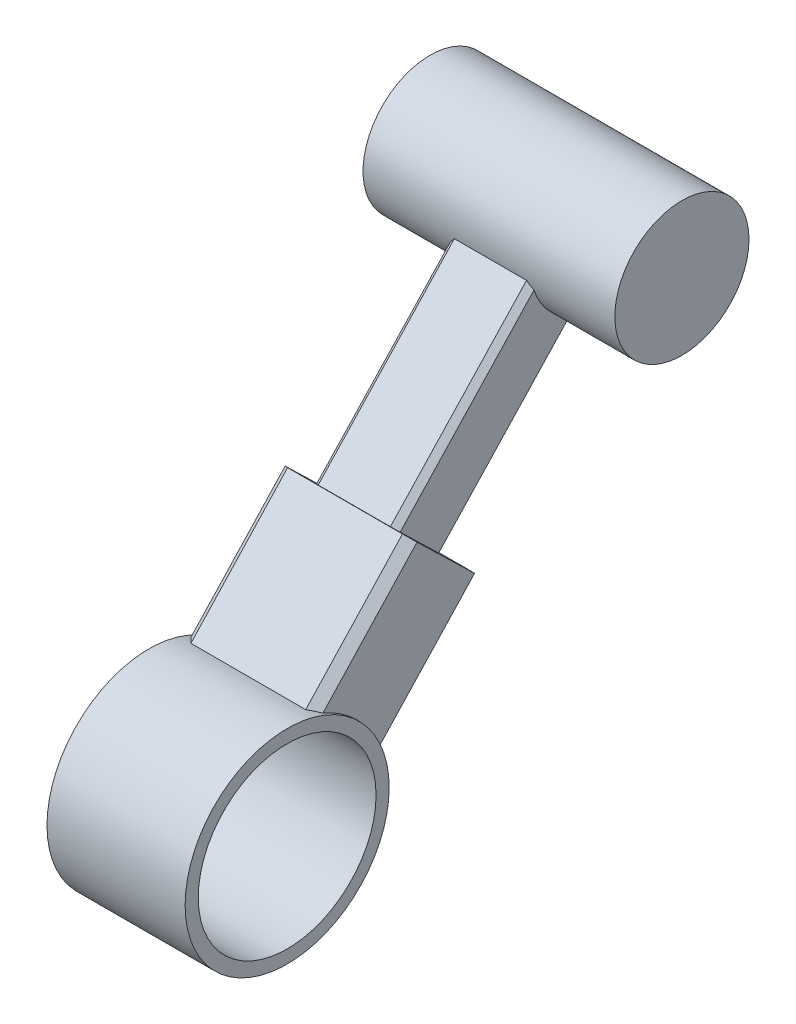
ISO-10303-21;
HEADER;
FILE_DESCRIPTION(('STEP AP214'),'2;1');
FILE_NAME('part.step','',(''),(''),'','','');
FILE_SCHEMA(('AUTOMOTIVE_DESIGN { 1 0 10303 214 1 1 1 1 }'));
ENDSEC;
DATA;
#1=APPLICATION_CONTEXT('core data for automotive mechanical design processes');
#2=APPLICATION_PROTOCOL_DEFINITION('international standard','automotive_design',2000,#1);
#3=PRODUCT_CONTEXT('',#1,'mechanical');
#4=PRODUCT('Part','Part','',(#3));
#5=PRODUCT_RELATED_PRODUCT_CATEGORY('part','',(#4));
#6=PRODUCT_DEFINITION_FORMATION('','',#4);
#7=PRODUCT_DEFINITION_CONTEXT('part definition',#1,'design');
#8=PRODUCT_DEFINITION('design','',#6,#7);
#9=PRODUCT_DEFINITION_SHAPE('','',#8);
#10=(LENGTH_UNIT() NAMED_UNIT(*) SI_UNIT(.MILLI.,.METRE.));
#11=(NAMED_UNIT(*) PLANE_ANGLE_UNIT() SI_UNIT($,.RADIAN.));
#12=(NAMED_UNIT(*) SI_UNIT($,.STERADIAN.) SOLID_ANGLE_UNIT());
#13=UNCERTAINTY_MEASURE_WITH_UNIT(LENGTH_MEASURE(1.E-05),#10,'distance_accuracy_value','');
#14=(GEOMETRIC_REPRESENTATION_CONTEXT(3) GLOBAL_UNCERTAINTY_ASSIGNED_CONTEXT((#13)) GLOBAL_UNIT_ASSIGNED_CONTEXT((#10,
#11,#12)) REPRESENTATION_CONTEXT('',''));
#15=CARTESIAN_POINT('',(0.,0.,0.));
#16=DIRECTION('',(0.,0.,1.));
#17=DIRECTION('',(1.,0.,0.));
#18=AXIS2_PLACEMENT_3D('',#15,#16,#17);
#19=CARTESIAN_POINT('',(-12.238736,481.689156,-114.7191));
#20=DIRECTION('',(0.,0.683904688442069,0.729571365341977));
#21=DIRECTION('',(0.,-0.729571365341977,0.683904688442069));
#22=AXIS2_PLACEMENT_3D('',#19,#20,#21);
#23=PLANE('',#22);
#24=DIRECTION('',(1.,0.,0.));
#25=VECTOR('',#24,1.);
#26=CARTESIAN_POINT('',(-36.886896,537.03398544481,-166.599683773447));
#27=LINE('',#26,#25);
#28=CARTESIAN_POINT('',(-10.573766,537.03398544481,-166.599683773447));
#29=VERTEX_POINT('',#28);
#30=CARTESIAN_POINT('',(10.5737660000001,537.03398544481,-166.599683773447));
#31=VERTEX_POINT('',#30);
#32=EDGE_CURVE('E167',#29,#31,#27,.T.);
#33=ORIENTED_EDGE('',*,*,#32,.F.);
#34=DIRECTION('',(0.,-0.729571365341977,0.683904688442069));
#35=VECTOR('',#34,1.);
#36=CARTESIAN_POINT('',(-10.573766,494.482198598491,-126.711376874032));
#37=LINE('',#36,#35);
#38=CARTESIAN_POINT('',(-10.573766,494.482198598491,-126.711376874032));
#39=VERTEX_POINT('',#38);
#40=EDGE_CURVE('E184',#29,#39,#37,.T.);
#41=ORIENTED_EDGE('',*,*,#40,.T.);
#42=DIRECTION('',(-1.,0.,0.));
#43=VECTOR('',#42,1.);
#44=CARTESIAN_POINT('',(-12.238736,494.482198598491,-126.711376874032));
#45=LINE('',#44,#43);
#46=CARTESIAN_POINT('',(10.5737660000001,494.482198598491,-126.711376874032));
#47=VERTEX_POINT('',#46);
#48=EDGE_CURVE('E265',#47,#39,#45,.T.);
#49=ORIENTED_EDGE('',*,*,#48,.F.);
#50=DIRECTION('',(0.,0.729571365341977,-0.683904688442069));
#51=VECTOR('',#50,1.);
#52=CARTESIAN_POINT('',(10.5737660000001,481.689156,-114.7191));
#53=LINE('',#52,#51);
#54=EDGE_CURVE('E182',#47,#31,#53,.T.);
#55=ORIENTED_EDGE('',*,*,#54,.T.);
#56=EDGE_LOOP('',(#33,#41,#49,#55));
#57=FACE_BOUND('',#56,.T.);
#58=ADVANCED_FACE('F33',(#57),#23,.T.);
#59=CARTESIAN_POINT('',(-12.238736,534.280364,-190.081662));
#60=DIRECTION('',(0.,-0.683673681243976,-0.72978784422208));
#61=DIRECTION('',(0.,0.72978784422208,-0.683673681243976));
#62=AXIS2_PLACEMENT_3D('',#59,#60,#61);
#63=PLANE('',#62);
#64=DIRECTION('',(1.,0.,0.));
#65=VECTOR('',#64,1.);
#66=CARTESIAN_POINT('',(-12.238736,481.231547229503,-140.384917755399));
#67=LINE('',#66,#65);
#68=CARTESIAN_POINT('',(-10.5737660000001,481.231547229503,-140.384917755399));
#69=VERTEX_POINT('',#68);
#70=CARTESIAN_POINT('',(10.5737660000001,481.231547229503,-140.384917755399));
#71=VERTEX_POINT('',#70);
#72=EDGE_CURVE('E262',#69,#71,#67,.T.);
#73=ORIENTED_EDGE('',*,*,#72,.F.);
#74=DIRECTION('',(0.,0.72978784422208,-0.683673681243976));
#75=VECTOR('',#74,1.);
#76=CARTESIAN_POINT('',(-10.5737660000001,522.674759628456,-179.209397784346));
#77=LINE('',#76,#75);
#78=CARTESIAN_POINT('',(-10.5737660000001,522.674759628456,-179.209397784346));
#79=VERTEX_POINT('',#78);
#80=EDGE_CURVE('E166',#69,#79,#77,.T.);
#81=ORIENTED_EDGE('',*,*,#80,.T.);
#82=DIRECTION('',(1.,0.,0.));
#83=VECTOR('',#82,1.);
#84=CARTESIAN_POINT('',(-36.886896,522.674759628456,-179.209397784346));
#85=LINE('',#84,#83);
#86=CARTESIAN_POINT('',(10.5737660000001,522.674759628456,-179.209397784346));
#87=VERTEX_POINT('',#86);
#88=EDGE_CURVE('E149',#87,#79,#85,.F.);
#89=ORIENTED_EDGE('',*,*,#88,.F.);
#90=DIRECTION('',(0.,-0.72978784422208,0.683673681243976));
#91=VECTOR('',#90,1.);
#92=CARTESIAN_POINT('',(10.5737660000001,534.280364,-190.081662));
#93=LINE('',#92,#91);
#94=EDGE_CURVE('E163',#87,#71,#93,.T.);
#95=ORIENTED_EDGE('',*,*,#94,.T.);
#96=EDGE_LOOP('',(#73,#81,#89,#95));
#97=FACE_BOUND('',#96,.T.);
#98=ADVANCED_FACE('F162',(#97),#63,.T.);
#99=CARTESIAN_POINT('',(-12.238736,0.,0.));
#100=DIRECTION('',(1.,0.,0.));
#101=DIRECTION('',(0.,0.,-1.));
#102=AXIS2_PLACEMENT_3D('',#99,#100,#101);
#103=PLANE('',#102);
#104=CARTESIAN_POINT('',(-12.238736,541.18891,-185.811668));
#105=DIRECTION('',(1.,0.,0.));
#106=DIRECTION('',(0.,0.,-1.));
#107=AXIS2_PLACEMENT_3D('',#104,#105,#106);
#108=CIRCLE('',#107,19.6561373616654);
#109=CARTESIAN_POINT('',(-12.238736,535.142411102994,-167.108631159178));
#110=VERTEX_POINT('',#109);
#111=CARTESIAN_POINT('',(-12.238736,523.348910888347,-177.559506605742));
#112=VERTEX_POINT('',#111);
#113=EDGE_CURVE('E307',#110,#112,#108,.T.);
#114=ORIENTED_EDGE('',*,*,#113,.T.);
#115=DIRECTION('',(0.,-0.72978784422208,0.683673681243976));
#116=VECTOR('',#115,1.);
#117=CARTESIAN_POINT('',(-12.238736,482.369843398563,-139.169842888405));
#118=LINE('',#117,#116);
#119=CARTESIAN_POINT('',(-12.238736,482.390389885968,-139.18909107511));
#120=VERTEX_POINT('',#119);
#121=EDGE_CURVE('E180',#112,#120,#118,.T.);
#122=ORIENTED_EDGE('',*,*,#121,.T.);
#123=DIRECTION('',(0.,0.695914649796083,0.718124501879163));
#124=VECTOR('',#123,1.);
#125=CARTESIAN_POINT('',(-12.238736,318.330290965437,-308.485105823577));
#126=LINE('',#125,#124);
#127=CARTESIAN_POINT('',(-12.238736,493.323362087641,-127.907197212572));
#128=VERTEX_POINT('',#127);
#129=EDGE_CURVE('E274',#120,#128,#126,.T.);
#130=ORIENTED_EDGE('',*,*,#129,.T.);
#131=DIRECTION('',(0.,0.729571365341977,-0.683904688442069));
#132=VECTOR('',#131,1.);
#133=CARTESIAN_POINT('',(-12.238736,535.895304655695,-167.8143982096));
#134=LINE('',#133,#132);
#135=EDGE_CURVE('E173',#128,#110,#134,.T.);
#136=ORIENTED_EDGE('',*,*,#135,.T.);
#137=EDGE_LOOP('',(#114,#122,#130,#136));
#138=FACE_BOUND('',#137,.T.);
#139=ADVANCED_FACE('F351',(#138),#103,.F.);
#140=CARTESIAN_POINT('',(12.238736,0.,0.));
#141=DIRECTION('',(1.,0.,0.));
#142=DIRECTION('',(0.,0.,-1.));
#143=AXIS2_PLACEMENT_3D('',#140,#141,#142);
#144=PLANE('',#143);
#145=DIRECTION('',(0.,0.695914649796083,0.718124501879163));
#146=VECTOR('',#145,1.);
#147=CARTESIAN_POINT('',(12.238736,318.330290965437,-308.485105823577));
#148=LINE('',#147,#146);
#149=CARTESIAN_POINT('',(12.238736,482.390389885968,-139.18909107511));
#150=VERTEX_POINT('',#149);
#151=CARTESIAN_POINT('',(12.238736,493.323362087641,-127.907197212572));
#152=VERTEX_POINT('',#151);
#153=EDGE_CURVE('E277',#150,#152,#148,.T.);
#154=ORIENTED_EDGE('',*,*,#153,.F.);
#155=DIRECTION('',(0.,0.72978784422208,-0.683673681243976));
#156=VECTOR('',#155,1.);
#157=CARTESIAN_POINT('',(12.238736,156.027396968547,166.551530060471));
#158=LINE('',#157,#156);
#159=CARTESIAN_POINT('',(12.238736,523.348910888347,-177.559506605742));
#160=VERTEX_POINT('',#159);
#161=EDGE_CURVE('E190',#150,#160,#158,.T.);
#162=ORIENTED_EDGE('',*,*,#161,.T.);
#163=CARTESIAN_POINT('',(12.238736,541.18891,-185.811668));
#164=DIRECTION('',(1.,0.,0.));
#165=DIRECTION('',(0.,0.,-1.));
#166=AXIS2_PLACEMENT_3D('',#163,#164,#165);
#167=CIRCLE('',#166,19.6561373616654);
#168=CARTESIAN_POINT('',(12.238736,535.142411102994,-167.108631159178));
#169=VERTEX_POINT('',#168);
#170=EDGE_CURVE('E151',#169,#160,#167,.T.);
#171=ORIENTED_EDGE('',*,*,#170,.F.);
#172=DIRECTION('',(0.,-0.729571365341977,0.683904688442069));
#173=VECTOR('',#172,1.);
#174=CARTESIAN_POINT('',(12.238736,166.919749940669,178.065557854515));
#175=LINE('',#174,#173);
#176=EDGE_CURVE('E187',#169,#152,#175,.T.);
#177=ORIENTED_EDGE('',*,*,#176,.T.);
#178=EDGE_LOOP('',(#154,#162,#171,#177));
#179=FACE_BOUND('',#178,.T.);
#180=ADVANCED_FACE('F497',(#179),#144,.T.);
#181=CARTESIAN_POINT('',(-19.311112,497.124482,-123.984766));
#182=DIRECTION('',(0.,0.718124501879163,-0.695914649796082));
#183=DIRECTION('',(0.,0.695914649796083,0.718124501879163));
#184=AXIS2_PLACEMENT_3D('',#181,#182,#183);
#185=PLANE('',#184);
#186=DIRECTION('',(1.,0.,0.));
#187=VECTOR('',#186,1.);
#188=CARTESIAN_POINT('',(-19.311112,477.32315,-144.41805));
#189=LINE('',#188,#187);
#190=CARTESIAN_POINT('',(-16.824198,477.32315,-144.41805));
#191=VERTEX_POINT('',#190);
#192=CARTESIAN_POINT('',(16.824198,477.32315,-144.41805));
#193=VERTEX_POINT('',#192);
#194=EDGE_CURVE('E263',#191,#193,#189,.T.);
#195=ORIENTED_EDGE('',*,*,#194,.F.);
#196=DIRECTION('',(0.707041596022458,-0.492131327127046,-0.507837511763545));
#197=VECTOR('',#196,1.);
#198=CARTESIAN_POINT('',(-32.2942649700346,488.090981244352,-133.306567505796));
#199=LINE('',#198,#197);
#200=CARTESIAN_POINT('',(-19.311112,479.054148988116,-142.631806835758));
#201=VERTEX_POINT('',#200);
#202=EDGE_CURVE('E215',#191,#201,#199,.F.);
#203=ORIENTED_EDGE('',*,*,#202,.T.);
#204=DIRECTION('',(0.,0.695914649796082,0.718124501879163));
#205=VECTOR('',#204,1.);
#206=CARTESIAN_POINT('',(-19.311112,497.124482,-123.984766));
#207=LINE('',#206,#205);
#208=CARTESIAN_POINT('',(-19.311112,495.393467348327,-125.771025327695));
#209=VERTEX_POINT('',#208);
#210=EDGE_CURVE('E258',#201,#209,#207,.T.);
#211=ORIENTED_EDGE('',*,*,#210,.T.);
#212=DIRECTION('',(-0.707038396481972,-0.492133553313604,-0.507839808998003));
#213=VECTOR('',#212,1.);
#214=CARTESIAN_POINT('',(-18.0674145007429,496.259142073494,-124.877722922031));
#215=LINE('',#214,#213);
#216=CARTESIAN_POINT('',(-16.824198,497.124482,-123.984766));
#217=VERTEX_POINT('',#216);
#218=EDGE_CURVE('E211',#209,#217,#215,.F.);
#219=ORIENTED_EDGE('',*,*,#218,.T.);
#220=DIRECTION('',(1.,0.,0.));
#221=VECTOR('',#220,1.);
#222=CARTESIAN_POINT('',(-19.311112,497.124482,-123.984766));
#223=LINE('',#222,#221);
#224=CARTESIAN_POINT('',(16.824198,497.124482,-123.984766));
#225=VERTEX_POINT('',#224);
#226=EDGE_CURVE('E256',#217,#225,#223,.T.);
#227=ORIENTED_EDGE('',*,*,#226,.T.);
#228=DIRECTION('',(0.707038396481976,-0.492133553313601,-0.507839808998));
#229=VECTOR('',#228,1.);
#230=CARTESIAN_POINT('',(-1.23996250231758,509.698027566785,-111.009940495682));
#231=LINE('',#230,#229);
#232=CARTESIAN_POINT('',(19.311112,495.393467348327,-125.771025327695));
#233=VERTEX_POINT('',#232);
#234=EDGE_CURVE('E209',#225,#233,#231,.T.);
#235=ORIENTED_EDGE('',*,*,#234,.T.);
#236=DIRECTION('',(0.,0.695914649796082,0.718124501879163));
#237=VECTOR('',#236,1.);
#238=CARTESIAN_POINT('',(19.311112,497.124482,-123.984766));
#239=LINE('',#238,#237);
#240=CARTESIAN_POINT('',(19.311112,479.054148988116,-142.631806835758));
#241=VERTEX_POINT('',#240);
#242=EDGE_CURVE('E246',#241,#233,#239,.T.);
#243=ORIENTED_EDGE('',*,*,#242,.F.);
#244=DIRECTION('',(-0.707041596022462,-0.492131327127043,-0.507837511763542));
#245=VECTOR('',#244,1.);
#246=CARTESIAN_POINT('',(12.9867132243449,474.652095728091,-147.174349955848));
#247=LINE('',#246,#245);
#248=EDGE_CURVE('E213',#241,#193,#247,.T.);
#249=ORIENTED_EDGE('',*,*,#248,.T.);
#250=EDGE_LOOP('',(#195,#203,#211,#219,#227,#235,#243,#249));
#251=FACE_BOUND('',#250,.T.);
#252=ORIENTED_EDGE('',*,*,#129,.F.);
#253=DIRECTION('',(0.707056239754541,-0.492121138007002,-0.507826997461599));
#254=VECTOR('',#253,1.);
#255=CARTESIAN_POINT('',(-11.1882655133554,481.659247577529,-139.943567512996));
#256=LINE('',#255,#254);
#257=EDGE_CURVE('E194',#120,#69,#256,.T.);
#258=ORIENTED_EDGE('',*,*,#257,.T.);
#259=ORIENTED_EDGE('',*,*,#72,.T.);
#260=DIRECTION('',(-0.707056239754517,-0.492121138007018,-0.507826997461616));
#261=VECTOR('',#260,1.);
#262=CARTESIAN_POINT('',(8.45825770596831,479.75912355146,-141.904333276626));
#263=LINE('',#262,#261);
#264=EDGE_CURVE('E156',#71,#150,#263,.F.);
#265=ORIENTED_EDGE('',*,*,#264,.T.);
#266=ORIENTED_EDGE('',*,*,#153,.T.);
#267=DIRECTION('',(0.707058114867813,-0.492119833271268,-0.507825651085719));
#268=VECTOR('',#267,1.);
#269=CARTESIAN_POINT('',(15.9499975239881,490.740285302287,-130.572711913751));
#270=LINE('',#269,#268);
#271=EDGE_CURVE('E200',#152,#47,#270,.F.);
#272=ORIENTED_EDGE('',*,*,#271,.T.);
#273=ORIENTED_EDGE('',*,*,#48,.T.);
#274=DIRECTION('',(-0.707058114867824,-0.49211983327126,-0.507825651085711));
#275=VECTOR('',#274,1.);
#276=CARTESIAN_POINT('',(-10.7192249502188,494.380957649799,-126.8158488892));
#277=LINE('',#276,#275);
#278=EDGE_CURVE('E196',#39,#128,#277,.T.);
#279=ORIENTED_EDGE('',*,*,#278,.T.);
#280=EDGE_LOOP('',(#252,#258,#259,#265,#266,#272,#273,#279));
#281=FACE_BOUND('',#280,.T.);
#282=ADVANCED_FACE('F254',(#251,#281),#185,.T.);
#283=CARTESIAN_POINT('',(-19.311112,447.540126,-77.789786));
#284=DIRECTION('',(0.,0.681657478586852,0.731671430279066));
#285=DIRECTION('',(0.,-0.731671430279066,0.681657478586852));
#286=AXIS2_PLACEMENT_3D('',#283,#284,#285);
#287=PLANE('',#286);
#288=ORIENTED_EDGE('',*,*,#226,.F.);
#289=DIRECTION('',(0.,-0.731671430279066,0.681657478586852));
#290=VECTOR('',#289,1.);
#291=CARTESIAN_POINT('',(-16.824198,447.540126,-77.789786));
#292=LINE('',#291,#290);
#293=CARTESIAN_POINT('',(-16.824198,466.715413431716,-95.6543322170037));
#294=VERTEX_POINT('',#293);
#295=EDGE_CURVE('E229',#217,#294,#292,.T.);
#296=ORIENTED_EDGE('',*,*,#295,.T.);
#297=DIRECTION('',(1.,0.,0.));
#298=VECTOR('',#297,1.);
#299=CARTESIAN_POINT('',(-20.236688,466.715413431716,-95.6543322170037));
#300=LINE('',#299,#298);
#301=CARTESIAN_POINT('',(16.824198,466.715413431716,-95.6543322170037));
#302=VERTEX_POINT('',#301);
#303=EDGE_CURVE('E240',#302,#294,#300,.F.);
#304=ORIENTED_EDGE('',*,*,#303,.F.);
#305=DIRECTION('',(0.,0.731671430279066,-0.681657478586852));
#306=VECTOR('',#305,1.);
#307=CARTESIAN_POINT('',(16.824198,497.124482,-123.984766));
#308=LINE('',#307,#306);
#309=EDGE_CURVE('E227',#302,#225,#308,.T.);
#310=ORIENTED_EDGE('',*,*,#309,.T.);
#311=EDGE_LOOP('',(#288,#296,#304,#310));
#312=FACE_BOUND('',#311,.T.);
#313=ADVANCED_FACE('F260',(#312),#287,.T.);
#314=CARTESIAN_POINT('',(-19.311112,477.32315,-144.41805));
#315=DIRECTION('',(0.,-0.681998033493572,-0.731354006149484));
#316=DIRECTION('',(0.,0.731354006149484,-0.681998033493572));
#317=AXIS2_PLACEMENT_3D('',#314,#315,#316);
#318=PLANE('',#317);
#319=DIRECTION('',(1.,0.,0.));
#320=VECTOR('',#319,1.);
#321=CARTESIAN_POINT('',(-20.236688,446.360114647019,-115.544578269254));
#322=LINE('',#321,#320);
#323=CARTESIAN_POINT('',(-16.824198,446.360114647019,-115.544578269254));
#324=VERTEX_POINT('',#323);
#325=CARTESIAN_POINT('',(16.824198,446.360114647019,-115.544578269254));
#326=VERTEX_POINT('',#325);
#327=EDGE_CURVE('E295',#324,#326,#322,.T.);
#328=ORIENTED_EDGE('',*,*,#327,.F.);
#329=DIRECTION('',(0.,0.731354006149484,-0.681998033493572));
#330=VECTOR('',#329,1.);
#331=CARTESIAN_POINT('',(-16.824198,477.32315,-144.41805));
#332=LINE('',#331,#330);
#333=EDGE_CURVE('E206',#324,#191,#332,.T.);
#334=ORIENTED_EDGE('',*,*,#333,.T.);
#335=ORIENTED_EDGE('',*,*,#194,.T.);
#336=DIRECTION('',(0.,-0.731354006149484,0.681998033493572));
#337=VECTOR('',#336,1.);
#338=CARTESIAN_POINT('',(16.824198,446.360114647019,-115.544578269254));
#339=LINE('',#338,#337);
#340=EDGE_CURVE('E204',#193,#326,#339,.T.);
#341=ORIENTED_EDGE('',*,*,#340,.T.);
#342=EDGE_LOOP('',(#328,#334,#335,#341));
#343=FACE_BOUND('',#342,.T.);
#344=ADVANCED_FACE('F292',(#343),#318,.T.);
#345=CARTESIAN_POINT('',(-19.311112,0.,0.));
#346=DIRECTION('',(-1.,0.,0.));
#347=DIRECTION('',(0.,0.,1.));
#348=AXIS2_PLACEMENT_3D('',#345,#346,#347);
#349=PLANE('',#348);
#350=ORIENTED_EDGE('',*,*,#210,.F.);
#351=DIRECTION('',(0.,-0.731354006149484,0.681998033493572));
#352=VECTOR('',#351,1.);
#353=CARTESIAN_POINT('',(-19.311112,151.676120003046,162.652870761515));
#354=LINE('',#353,#352);
#355=CARTESIAN_POINT('',(-19.311112,449.038801627589,-114.642067663779));
#356=VERTEX_POINT('',#355);
#357=EDGE_CURVE('E219',#201,#356,#354,.T.);
#358=ORIENTED_EDGE('',*,*,#357,.T.);
#359=CARTESIAN_POINT('',(-19.311112,438.166256,-86.798404));
#360=DIRECTION('',(-1.,0.,0.));
#361=DIRECTION('',(0.,0.,1.));
#362=AXIS2_PLACEMENT_3D('',#359,#360,#361);
#363=CIRCLE('',#362,29.8911668331234);
#364=CARTESIAN_POINT('',(-19.311112,465.798060138105,-98.1986344678023));
#365=VERTEX_POINT('',#364);
#366=EDGE_CURVE('E238',#365,#356,#363,.T.);
#367=ORIENTED_EDGE('',*,*,#366,.F.);
#368=DIRECTION('',(0.,0.731671430279066,-0.681657478586852));
#369=VECTOR('',#368,1.);
#370=CARTESIAN_POINT('',(-19.311112,167.459790657562,179.746497901937));
#371=LINE('',#370,#369);
#372=EDGE_CURVE('E217',#365,#209,#371,.T.);
#373=ORIENTED_EDGE('',*,*,#372,.T.);
#374=EDGE_LOOP('',(#350,#358,#367,#373));
#375=FACE_BOUND('',#374,.T.);
#376=ADVANCED_FACE('F243',(#375),#349,.T.);
#377=CARTESIAN_POINT('',(19.311112,0.,0.));
#378=DIRECTION('',(-1.,0.,0.));
#379=DIRECTION('',(0.,0.,1.));
#380=AXIS2_PLACEMENT_3D('',#377,#378,#379);
#381=PLANE('',#380);
#382=CARTESIAN_POINT('',(19.311112,438.166256,-86.798404));
#383=DIRECTION('',(-1.,0.,0.));
#384=DIRECTION('',(0.,0.,1.));
#385=AXIS2_PLACEMENT_3D('',#382,#383,#384);
#386=CIRCLE('',#385,29.8911668331234);
#387=CARTESIAN_POINT('',(19.311112,465.798060138105,-98.1986344678023));
#388=VERTEX_POINT('',#387);
#389=CARTESIAN_POINT('',(19.311112,449.038801627588,-114.642067663779));
#390=VERTEX_POINT('',#389);
#391=EDGE_CURVE('E175',#388,#390,#386,.T.);
#392=ORIENTED_EDGE('',*,*,#391,.T.);
#393=DIRECTION('',(0.,0.731354006149484,-0.681998033493572));
#394=VECTOR('',#393,1.);
#395=CARTESIAN_POINT('',(19.311112,479.019220457468,-142.599235483151));
#396=LINE('',#395,#394);
#397=EDGE_CURVE('E224',#390,#241,#396,.T.);
#398=ORIENTED_EDGE('',*,*,#397,.T.);
#399=ORIENTED_EDGE('',*,*,#242,.T.);
#400=DIRECTION('',(0.,-0.731671430279066,0.681657478586852));
#401=VECTOR('',#400,1.);
#402=CARTESIAN_POINT('',(19.311112,465.020189905013,-97.4739361403647));
#403=LINE('',#402,#401);
#404=EDGE_CURVE('E221',#233,#388,#403,.T.);
#405=ORIENTED_EDGE('',*,*,#404,.T.);
#406=EDGE_LOOP('',(#392,#398,#399,#405));
#407=FACE_BOUND('',#406,.T.);
#408=ADVANCED_FACE('F282',(#407),#381,.F.);
#409=CARTESIAN_POINT('',(-20.236688,438.166256,-86.798404));
#410=DIRECTION('',(1.,0.,0.));
#411=DIRECTION('',(0.,0.,-1.));
#412=AXIS2_PLACEMENT_3D('',#409,#410,#411);
#413=CYLINDRICAL_SURFACE('',#412,29.8911668331234);
#414=ORIENTED_EDGE('',*,*,#391,.F.);
#415=CARTESIAN_POINT('',(29.805315005699,438.166256,-86.798404));
#416=DIRECTION('',(0.707106781186536,0.482004625555295,0.517369829950797));
#417=DIRECTION('',(0.707106781186559,-0.482004625555279,-0.517369829950779));
#418=AXIS2_PLACEMENT_3D('',#415,#416,#417);
#419=ELLIPSE('',#418,42.2724935305607,29.8911668331234);
#420=EDGE_CURVE('E11',#388,#302,#419,.T.);
#421=ORIENTED_EDGE('',*,*,#420,.T.);
#422=ORIENTED_EDGE('',*,*,#303,.T.);
#423=CARTESIAN_POINT('',(-29.805315005699,438.166256,-86.798404));
#424=DIRECTION('',(0.70710678118654,-0.482004625555293,-0.517369829950794));
#425=DIRECTION('',(0.707106781186555,0.482004625555282,0.517369829950782));
#426=AXIS2_PLACEMENT_3D('',#423,#424,#425);
#427=ELLIPSE('',#426,42.2724935305604,29.8911668331234);
#428=EDGE_CURVE('E41',#294,#365,#427,.F.);
#429=ORIENTED_EDGE('',*,*,#428,.T.);
#430=ORIENTED_EDGE('',*,*,#366,.T.);
#431=CARTESIAN_POINT('',(-32.2596322292983,438.166256,-86.798404));
#432=DIRECTION('',(0.707106781186559,0.482245434239187,0.51714537719624));
#433=DIRECTION('',(0.707106781186536,-0.482245434239203,-0.517145377196257));
#434=AXIS2_PLACEMENT_3D('',#431,#432,#433);
#435=ELLIPSE('',#434,42.2724935305592,29.8911668331234);
#436=EDGE_CURVE('E231',#356,#324,#435,.F.);
#437=ORIENTED_EDGE('',*,*,#436,.T.);
#438=ORIENTED_EDGE('',*,*,#327,.T.);
#439=CARTESIAN_POINT('',(32.2596322292985,438.166256,-86.798404));
#440=DIRECTION('',(0.707106781186555,-0.48224543423919,-0.517145377196243));
#441=DIRECTION('',(0.70710678118654,0.482245434239201,0.517145377196254));
#442=AXIS2_PLACEMENT_3D('',#439,#440,#441);
#443=ELLIPSE('',#442,42.2724935305595,29.8911668331234);
#444=EDGE_CURVE('E233',#326,#390,#443,.T.);
#445=ORIENTED_EDGE('',*,*,#444,.T.);
#446=EDGE_LOOP('',(#414,#421,#422,#429,#430,#437,#438,#445));
#447=FACE_BOUND('',#446,.T.);
#448=CARTESIAN_POINT('',(-20.236688,438.166256,-86.798404));
#449=DIRECTION('',(1.,0.,0.));
#450=DIRECTION('',(0.,0.,-1.));
#451=AXIS2_PLACEMENT_3D('',#448,#449,#450);
#452=CIRCLE('',#451,29.8911668331234);
#453=CARTESIAN_POINT('',(-20.236688,438.166256,-116.689570833123));
#454=VERTEX_POINT('',#453);
#455=EDGE_CURVE('E301',#454,#454,#452,.T.);
#456=ORIENTED_EDGE('',*,*,#455,.T.);
#457=EDGE_LOOP('',(#456));
#458=FACE_BOUND('',#457,.T.);
#459=CARTESIAN_POINT('',(20.236688,438.166256,-86.798404));
#460=DIRECTION('',(1.,0.,0.));
#461=DIRECTION('',(0.,0.,-1.));
#462=AXIS2_PLACEMENT_3D('',#459,#460,#461);
#463=CIRCLE('',#462,29.8911668331234);
#464=CARTESIAN_POINT('',(20.236688,438.166256,-116.689570833123));
#465=VERTEX_POINT('',#464);
#466=EDGE_CURVE('E304',#465,#465,#463,.T.);
#467=ORIENTED_EDGE('',*,*,#466,.F.);
#468=EDGE_LOOP('',(#467));
#469=FACE_BOUND('',#468,.T.);
#470=ADVANCED_FACE('F236',(#447,#458,#469),#413,.T.);
#471=CARTESIAN_POINT('',(-20.236688,438.166256,-86.798404));
#472=DIRECTION('',(1.,0.,0.));
#473=DIRECTION('',(0.,0.,-1.));
#474=AXIS2_PLACEMENT_3D('',#471,#472,#473);
#475=PLANE('',#474);
#476=CARTESIAN_POINT('',(-20.236688,438.166256,-86.798404));
#477=DIRECTION('',(1.,0.,0.));
#478=DIRECTION('',(0.,0.,-1.));
#479=AXIS2_PLACEMENT_3D('',#476,#477,#478);
#480=CIRCLE('',#479,26.0502400000001);
#481=CARTESIAN_POINT('',(-20.236688,438.166256,-112.848644));
#482=VERTEX_POINT('',#481);
#483=EDGE_CURVE('E317',#482,#482,#480,.T.);
#484=ORIENTED_EDGE('',*,*,#483,.T.);
#485=EDGE_LOOP('',(#484));
#486=FACE_BOUND('',#485,.T.);
#487=ORIENTED_EDGE('',*,*,#455,.F.);
#488=EDGE_LOOP('',(#487));
#489=FACE_BOUND('',#488,.T.);
#490=ADVANCED_FACE('F330',(#486,#489),#475,.F.);
#491=CARTESIAN_POINT('',(20.236688,438.166256,-86.798404));
#492=DIRECTION('',(1.,0.,0.));
#493=DIRECTION('',(0.,0.,-1.));
#494=AXIS2_PLACEMENT_3D('',#491,#492,#493);
#495=PLANE('',#494);
#496=CARTESIAN_POINT('',(20.236688,438.166256,-86.798404));
#497=DIRECTION('',(1.,0.,0.));
#498=DIRECTION('',(0.,0.,-1.));
#499=AXIS2_PLACEMENT_3D('',#496,#497,#498);
#500=CIRCLE('',#499,26.0502400000001);
#501=CARTESIAN_POINT('',(20.236688,438.166256,-112.848644));
#502=VERTEX_POINT('',#501);
#503=EDGE_CURVE('E320',#502,#502,#500,.T.);
#504=ORIENTED_EDGE('',*,*,#503,.F.);
#505=EDGE_LOOP('',(#504));
#506=FACE_BOUND('',#505,.T.);
#507=ORIENTED_EDGE('',*,*,#466,.T.);
#508=EDGE_LOOP('',(#507));
#509=FACE_BOUND('',#508,.T.);
#510=ADVANCED_FACE('F327',(#506,#509),#495,.T.);
#511=CARTESIAN_POINT('',(-36.886896,541.18891,-185.811668));
#512=DIRECTION('',(1.,0.,0.));
#513=DIRECTION('',(0.,0.,-1.));
#514=AXIS2_PLACEMENT_3D('',#511,#512,#513);
#515=CYLINDRICAL_SURFACE('',#514,19.6561373616654);
#516=CARTESIAN_POINT('',(36.886896,541.18891,-185.811668));
#517=DIRECTION('',(1.,0.,0.));
#518=DIRECTION('',(0.,0.,-1.));
#519=AXIS2_PLACEMENT_3D('',#516,#517,#518);
#520=CIRCLE('',#519,19.6561373616654);
#521=CARTESIAN_POINT('',(36.886896,541.18891,-205.467805361665));
#522=VERTEX_POINT('',#521);
#523=EDGE_CURVE('E314',#522,#522,#520,.T.);
#524=ORIENTED_EDGE('',*,*,#523,.F.);
#525=EDGE_LOOP('',(#524));
#526=FACE_BOUND('',#525,.T.);
#527=CARTESIAN_POINT('',(-36.886896,541.18891,-185.811668));
#528=DIRECTION('',(1.,0.,0.));
#529=DIRECTION('',(0.,0.,-1.));
#530=AXIS2_PLACEMENT_3D('',#527,#528,#529);
#531=CIRCLE('',#530,19.6561373616654);
#532=CARTESIAN_POINT('',(-36.886896,541.18891,-205.467805361665));
#533=VERTEX_POINT('',#532);
#534=EDGE_CURVE('E168',#533,#533,#531,.T.);
#535=ORIENTED_EDGE('',*,*,#534,.T.);
#536=EDGE_LOOP('',(#535));
#537=FACE_BOUND('',#536,.T.);
#538=ORIENTED_EDGE('',*,*,#113,.F.);
#539=CARTESIAN_POINT('',(-21.7487071796776,541.18891,-185.811668));
#540=DIRECTION('',(-0.707106781186547,0.48359364288266,0.51588485979284));
#541=DIRECTION('',(0.707106781186548,0.48359364288266,0.51588485979284));
#542=AXIS2_PLACEMENT_3D('',#539,#540,#541);
#543=ELLIPSE('',#542,27.7979760407357,19.6561373616654);
#544=EDGE_CURVE('E157',#110,#29,#543,.T.);
#545=ORIENTED_EDGE('',*,*,#544,.T.);
#546=ORIENTED_EDGE('',*,*,#32,.T.);
#547=CARTESIAN_POINT('',(21.7487071796774,541.18891,-185.811668));
#548=DIRECTION('',(-0.707106781186559,-0.483593642882652,-0.515884859792832));
#549=DIRECTION('',(0.707106781186536,-0.483593642882668,-0.515884859792849));
#550=AXIS2_PLACEMENT_3D('',#547,#548,#549);
#551=ELLIPSE('',#550,27.7979760407352,19.6561373616654);
#552=EDGE_CURVE('E202',#31,#169,#551,.F.);
#553=ORIENTED_EDGE('',*,*,#552,.T.);
#554=ORIENTED_EDGE('',*,*,#170,.T.);
#555=CARTESIAN_POINT('',(18.4131467919646,541.18891,-185.811668));
#556=DIRECTION('',(-0.707106781186547,0.483430296126385,0.516037933476944));
#557=DIRECTION('',(0.707106781186548,0.483430296126386,0.516037933476944));
#558=AXIS2_PLACEMENT_3D('',#555,#556,#557);
#559=ELLIPSE('',#558,27.7979760407357,19.6561373616654);
#560=EDGE_CURVE('E145',#160,#87,#559,.F.);
#561=ORIENTED_EDGE('',*,*,#560,.T.);
#562=ORIENTED_EDGE('',*,*,#88,.T.);
#563=CARTESIAN_POINT('',(-18.4131467919652,541.18891,-185.811668));
#564=DIRECTION('',(-0.707106781186524,-0.483430296126402,-0.516037933476962));
#565=DIRECTION('',(0.707106781186571,-0.483430296126369,-0.516037933476927));
#566=AXIS2_PLACEMENT_3D('',#563,#564,#565);
#567=ELLIPSE('',#566,27.7979760407366,19.6561373616654);
#568=EDGE_CURVE('E192',#79,#112,#567,.T.);
#569=ORIENTED_EDGE('',*,*,#568,.T.);
#570=EDGE_LOOP('',(#538,#545,#546,#553,#554,#561,#562,#569));
#571=FACE_BOUND('',#570,.T.);
#572=ADVANCED_FACE('F148',(#526,#537,#571),#515,.T.);
#573=CARTESIAN_POINT('',(-36.886896,541.18891,-185.811668));
#574=DIRECTION('',(1.,0.,0.));
#575=DIRECTION('',(0.,0.,-1.));
#576=AXIS2_PLACEMENT_3D('',#573,#574,#575);
#577=PLANE('',#576);
#578=ORIENTED_EDGE('',*,*,#534,.F.);
#579=EDGE_LOOP('',(#578));
#580=FACE_BOUND('',#579,.T.);
#581=ADVANCED_FACE('F427',(#580),#577,.F.);
#582=CARTESIAN_POINT('',(36.886896,541.18891,-185.811668));
#583=DIRECTION('',(1.,0.,0.));
#584=DIRECTION('',(0.,0.,-1.));
#585=AXIS2_PLACEMENT_3D('',#582,#583,#584);
#586=PLANE('',#585);
#587=ORIENTED_EDGE('',*,*,#523,.T.);
#588=EDGE_LOOP('',(#587));
#589=FACE_BOUND('',#588,.T.);
#590=ADVANCED_FACE('F420',(#589),#586,.T.);
#591=CARTESIAN_POINT('',(-36.886896,438.166256,-86.798404));
#592=DIRECTION('',(1.,0.,0.));
#593=DIRECTION('',(0.,0.,-1.));
#594=AXIS2_PLACEMENT_3D('',#591,#592,#593);
#595=CYLINDRICAL_SURFACE('',#594,26.0502400000001);
#596=ORIENTED_EDGE('',*,*,#503,.T.);
#597=EDGE_LOOP('',(#596));
#598=FACE_BOUND('',#597,.T.);
#599=ORIENTED_EDGE('',*,*,#483,.F.);
#600=EDGE_LOOP('',(#599));
#601=FACE_BOUND('',#600,.T.);
#602=ADVANCED_FACE('F324',(#598,#601),#595,.F.);
#603=CARTESIAN_POINT('',(-10.5737660000001,534.280364,-190.081662));
#604=DIRECTION('',(-0.707106781186524,-0.483430296126402,-0.516037933476962));
#605=DIRECTION('',(0.,-0.72978784422208,0.683673681243976));
#606=AXIS2_PLACEMENT_3D('',#603,#604,#605);
#607=PLANE('',#606);
#608=ORIENTED_EDGE('',*,*,#257,.F.);
#609=ORIENTED_EDGE('',*,*,#121,.F.);
#610=ORIENTED_EDGE('',*,*,#568,.F.);
#611=ORIENTED_EDGE('',*,*,#80,.F.);
#612=EDGE_LOOP('',(#608,#609,#610,#611));
#613=FACE_BOUND('',#612,.T.);
#614=ADVANCED_FACE('F356',(#613),#607,.T.);
#615=CARTESIAN_POINT('',(-10.573766,481.689156,-114.7191));
#616=DIRECTION('',(-0.707106781186547,0.48359364288266,0.51588485979284));
#617=DIRECTION('',(0.,0.729571365341977,-0.683904688442069));
#618=AXIS2_PLACEMENT_3D('',#615,#616,#617);
#619=PLANE('',#618);
#620=ORIENTED_EDGE('',*,*,#544,.F.);
#621=ORIENTED_EDGE('',*,*,#135,.F.);
#622=ORIENTED_EDGE('',*,*,#278,.F.);
#623=ORIENTED_EDGE('',*,*,#40,.F.);
#624=EDGE_LOOP('',(#620,#621,#622,#623));
#625=FACE_BOUND('',#624,.T.);
#626=ADVANCED_FACE('F359',(#625),#619,.T.);
#627=CARTESIAN_POINT('',(12.238736,156.027396968547,166.551530060471));
#628=DIRECTION('',(-0.707106781186547,0.483430296126385,0.516037933476944));
#629=DIRECTION('',(0.,0.72978784422208,-0.683673681243976));
#630=AXIS2_PLACEMENT_3D('',#627,#628,#629);
#631=PLANE('',#630);
#632=ORIENTED_EDGE('',*,*,#264,.F.);
#633=ORIENTED_EDGE('',*,*,#94,.F.);
#634=ORIENTED_EDGE('',*,*,#560,.F.);
#635=ORIENTED_EDGE('',*,*,#161,.F.);
#636=EDGE_LOOP('',(#632,#633,#634,#635));
#637=FACE_BOUND('',#636,.T.);
#638=ADVANCED_FACE('F171',(#637),#631,.F.);
#639=CARTESIAN_POINT('',(12.238736,166.919749940669,178.065557854515));
#640=DIRECTION('',(-0.707106781186559,-0.483593642882652,-0.515884859792832));
#641=DIRECTION('',(0.,-0.729571365341977,0.683904688442069));
#642=AXIS2_PLACEMENT_3D('',#639,#640,#641);
#643=PLANE('',#642);
#644=ORIENTED_EDGE('',*,*,#552,.F.);
#645=ORIENTED_EDGE('',*,*,#54,.F.);
#646=ORIENTED_EDGE('',*,*,#271,.F.);
#647=ORIENTED_EDGE('',*,*,#176,.F.);
#648=EDGE_LOOP('',(#644,#645,#646,#647));
#649=FACE_BOUND('',#648,.T.);
#650=ADVANCED_FACE('F366',(#649),#643,.F.);
#651=CARTESIAN_POINT('',(-16.824198,477.32315,-144.41805));
#652=DIRECTION('',(0.707106781186559,0.482245434239187,0.51714537719624));
#653=DIRECTION('',(0.,0.731354006149484,-0.681998033493572));
#654=AXIS2_PLACEMENT_3D('',#651,#652,#653);
#655=PLANE('',#654);
#656=ORIENTED_EDGE('',*,*,#436,.F.);
#657=ORIENTED_EDGE('',*,*,#357,.F.);
#658=ORIENTED_EDGE('',*,*,#202,.F.);
#659=ORIENTED_EDGE('',*,*,#333,.F.);
#660=EDGE_LOOP('',(#656,#657,#658,#659));
#661=FACE_BOUND('',#660,.T.);
#662=ADVANCED_FACE('F297',(#661),#655,.F.);
#663=CARTESIAN_POINT('',(19.311112,151.676120003046,162.652870761515));
#664=DIRECTION('',(0.707106781186555,-0.48224543423919,-0.517145377196243));
#665=DIRECTION('',(0.,-0.731354006149484,0.681998033493572));
#666=AXIS2_PLACEMENT_3D('',#663,#664,#665);
#667=PLANE('',#666);
#668=ORIENTED_EDGE('',*,*,#444,.F.);
#669=ORIENTED_EDGE('',*,*,#340,.F.);
#670=ORIENTED_EDGE('',*,*,#248,.F.);
#671=ORIENTED_EDGE('',*,*,#397,.F.);
#672=EDGE_LOOP('',(#668,#669,#670,#671));
#673=FACE_BOUND('',#672,.T.);
#674=ADVANCED_FACE('F288',(#673),#667,.T.);
#675=CARTESIAN_POINT('',(-16.824198,447.540126,-77.789786));
#676=DIRECTION('',(0.70710678118654,-0.482004625555293,-0.517369829950794));
#677=DIRECTION('',(0.,-0.731671430279066,0.681657478586852));
#678=AXIS2_PLACEMENT_3D('',#675,#676,#677);
#679=PLANE('',#678);
#680=ORIENTED_EDGE('',*,*,#218,.F.);
#681=ORIENTED_EDGE('',*,*,#372,.F.);
#682=ORIENTED_EDGE('',*,*,#428,.F.);
#683=ORIENTED_EDGE('',*,*,#295,.F.);
#684=EDGE_LOOP('',(#680,#681,#682,#683));
#685=FACE_BOUND('',#684,.T.);
#686=ADVANCED_FACE('F249',(#685),#679,.F.);
#687=CARTESIAN_POINT('',(19.311112,167.459790657562,179.746497901937));
#688=DIRECTION('',(0.707106781186536,0.482004625555295,0.517369829950797));
#689=DIRECTION('',(0.,0.731671430279066,-0.681657478586852));
#690=AXIS2_PLACEMENT_3D('',#687,#688,#689);
#691=PLANE('',#690);
#692=ORIENTED_EDGE('',*,*,#234,.F.);
#693=ORIENTED_EDGE('',*,*,#309,.F.);
#694=ORIENTED_EDGE('',*,*,#420,.F.);
#695=ORIENTED_EDGE('',*,*,#404,.F.);
#696=EDGE_LOOP('',(#692,#693,#694,#695));
#697=FACE_BOUND('',#696,.T.);
#698=ADVANCED_FACE('F35',(#697),#691,.T.);
#699=CLOSED_SHELL('',(#58,#98,#139,#180,#282,#313,#344,#376,#408,#470,#490,#510,#572,#581,#590,
#602,#614,#626,#638,#650,#662,#674,#686,#698));
#700=MANIFOLD_SOLID_BREP('B2',#699);
#701=ADVANCED_BREP_SHAPE_REPRESENTATION('',(#18,#700),#14);
#702=SHAPE_DEFINITION_REPRESENTATION(#9,#701);
ENDSEC;
END-ISO-10303-21;
